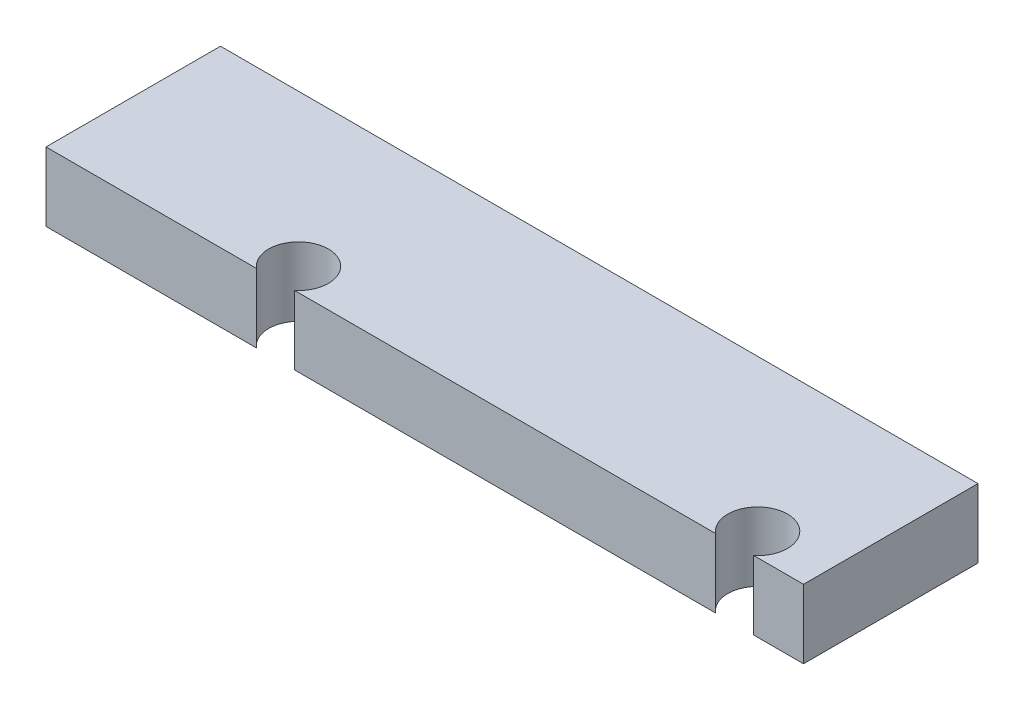
ISO-10303-21;
HEADER;
FILE_DESCRIPTION(('STEP AP214'),'2;1');
FILE_NAME('part.step','',(''),(''),'','','');
FILE_SCHEMA(('AUTOMOTIVE_DESIGN { 1 0 10303 214 1 1 1 1 }'));
ENDSEC;
DATA;
#1=APPLICATION_CONTEXT('core data for automotive mechanical design processes');
#2=APPLICATION_PROTOCOL_DEFINITION('international standard','automotive_design',2000,#1);
#3=PRODUCT_CONTEXT('',#1,'mechanical');
#4=PRODUCT('Part','Part','',(#3));
#5=PRODUCT_RELATED_PRODUCT_CATEGORY('part','',(#4));
#6=PRODUCT_DEFINITION_FORMATION('','',#4);
#7=PRODUCT_DEFINITION_CONTEXT('part definition',#1,'design');
#8=PRODUCT_DEFINITION('design','',#6,#7);
#9=PRODUCT_DEFINITION_SHAPE('','',#8);
#10=(LENGTH_UNIT() NAMED_UNIT(*) SI_UNIT(.MILLI.,.METRE.));
#11=(NAMED_UNIT(*) PLANE_ANGLE_UNIT() SI_UNIT($,.RADIAN.));
#12=(NAMED_UNIT(*) SI_UNIT($,.STERADIAN.) SOLID_ANGLE_UNIT());
#13=UNCERTAINTY_MEASURE_WITH_UNIT(LENGTH_MEASURE(1.E-05),#10,'distance_accuracy_value','');
#14=(GEOMETRIC_REPRESENTATION_CONTEXT(3) GLOBAL_UNCERTAINTY_ASSIGNED_CONTEXT((#13)) GLOBAL_UNIT_ASSIGNED_CONTEXT((#10,
#11,#12)) REPRESENTATION_CONTEXT('',''));
#15=CARTESIAN_POINT('',(0.,0.,0.));
#16=DIRECTION('',(0.,0.,1.));
#17=DIRECTION('',(1.,0.,0.));
#18=AXIS2_PLACEMENT_3D('',#15,#16,#17);
#19=CARTESIAN_POINT('',(-82.5,7.5,19.));
#20=DIRECTION('',(0.,0.,-1.));
#21=DIRECTION('',(-1.,0.,0.));
#22=AXIS2_PLACEMENT_3D('',#19,#20,#21);
#23=PLANE('',#22);
#24=DIRECTION('',(1.,0.,0.));
#25=VECTOR('',#24,1.);
#26=CARTESIAN_POINT('',(-82.5,-7.5,19.));
#27=LINE('',#26,#25);
#28=CARTESIAN_POINT('',(-28.3466880685408,-7.5,19.));
#29=VERTEX_POINT('',#28);
#30=CARTESIAN_POINT('',(63.346688068541,-7.5,19.));
#31=VERTEX_POINT('',#30);
#32=EDGE_CURVE('E110',#29,#31,#27,.T.);
#33=ORIENTED_EDGE('',*,*,#32,.T.);
#34=DIRECTION('',(0.,1.,0.));
#35=VECTOR('',#34,1.);
#36=CARTESIAN_POINT('',(63.346688068541,-7.5,19.));
#37=LINE('',#36,#35);
#38=CARTESIAN_POINT('',(63.346688068541,7.5,19.));
#39=VERTEX_POINT('',#38);
#40=EDGE_CURVE('E48',#31,#39,#37,.T.);
#41=ORIENTED_EDGE('',*,*,#40,.T.);
#42=DIRECTION('',(1.,0.,0.));
#43=VECTOR('',#42,1.);
#44=CARTESIAN_POINT('',(-82.5,7.5,19.));
#45=LINE('',#44,#43);
#46=CARTESIAN_POINT('',(-28.3466880685408,7.5,19.));
#47=VERTEX_POINT('',#46);
#48=EDGE_CURVE('E112',#47,#39,#45,.T.);
#49=ORIENTED_EDGE('',*,*,#48,.F.);
#50=DIRECTION('',(0.,1.,0.));
#51=VECTOR('',#50,1.);
#52=CARTESIAN_POINT('',(-28.3466880685408,-7.5,19.));
#53=LINE('',#52,#51);
#54=EDGE_CURVE('E98',#47,#29,#53,.F.);
#55=ORIENTED_EDGE('',*,*,#54,.T.);
#56=EDGE_LOOP('',(#33,#41,#49,#55));
#57=FACE_BOUND('',#56,.T.);
#58=ADVANCED_FACE('F33',(#57),#23,.F.);
#59=CARTESIAN_POINT('',(-82.5,-7.5,19.));
#60=VERTEX_POINT('',#59);
#61=CARTESIAN_POINT('',(-36.653311931459,-7.5,19.));
#62=VERTEX_POINT('',#61);
#63=EDGE_CURVE('E117',#60,#62,#27,.T.);
#64=ORIENTED_EDGE('',*,*,#63,.T.);
#65=DIRECTION('',(0.,1.,0.));
#66=VECTOR('',#65,1.);
#67=CARTESIAN_POINT('',(-36.653311931459,-7.5,19.));
#68=LINE('',#67,#66);
#69=CARTESIAN_POINT('',(-36.653311931459,7.5,19.));
#70=VERTEX_POINT('',#69);
#71=EDGE_CURVE('E56',#62,#70,#68,.T.);
#72=ORIENTED_EDGE('',*,*,#71,.T.);
#73=CARTESIAN_POINT('',(-82.5,7.5,19.));
#74=VERTEX_POINT('',#73);
#75=EDGE_CURVE('E129',#74,#70,#45,.T.);
#76=ORIENTED_EDGE('',*,*,#75,.F.);
#77=DIRECTION('',(0.,-1.,0.));
#78=VECTOR('',#77,1.);
#79=CARTESIAN_POINT('',(-82.5,7.5,19.));
#80=LINE('',#79,#78);
#81=EDGE_CURVE('E128',#74,#60,#80,.T.);
#82=ORIENTED_EDGE('',*,*,#81,.T.);
#83=EDGE_LOOP('',(#64,#72,#76,#82));
#84=FACE_BOUND('',#83,.T.);
#85=ADVANCED_FACE('F175',(#84),#23,.F.);
#86=CARTESIAN_POINT('',(82.5,7.5,19.));
#87=DIRECTION('',(-1.,0.,0.));
#88=DIRECTION('',(0.,0.,1.));
#89=AXIS2_PLACEMENT_3D('',#86,#87,#88);
#90=PLANE('',#89);
#91=DIRECTION('',(0.,0.,-1.));
#92=VECTOR('',#91,1.);
#93=CARTESIAN_POINT('',(82.5,-7.5,19.));
#94=LINE('',#93,#92);
#95=CARTESIAN_POINT('',(82.5,-7.5,19.));
#96=VERTEX_POINT('',#95);
#97=CARTESIAN_POINT('',(82.5,-7.5,-19.));
#98=VERTEX_POINT('',#97);
#99=EDGE_CURVE('E142',#96,#98,#94,.T.);
#100=ORIENTED_EDGE('',*,*,#99,.T.);
#101=DIRECTION('',(0.,-1.,0.));
#102=VECTOR('',#101,1.);
#103=CARTESIAN_POINT('',(82.5,7.5,-19.));
#104=LINE('',#103,#102);
#105=CARTESIAN_POINT('',(82.5,7.5,-19.));
#106=VERTEX_POINT('',#105);
#107=EDGE_CURVE('E11',#106,#98,#104,.T.);
#108=ORIENTED_EDGE('',*,*,#107,.F.);
#109=DIRECTION('',(0.,0.,-1.));
#110=VECTOR('',#109,1.);
#111=CARTESIAN_POINT('',(82.5,7.5,19.));
#112=LINE('',#111,#110);
#113=CARTESIAN_POINT('',(82.5,7.5,19.));
#114=VERTEX_POINT('',#113);
#115=EDGE_CURVE('E120',#114,#106,#112,.T.);
#116=ORIENTED_EDGE('',*,*,#115,.F.);
#117=DIRECTION('',(0.,-1.,0.));
#118=VECTOR('',#117,1.);
#119=CARTESIAN_POINT('',(82.5,7.5,19.));
#120=LINE('',#119,#118);
#121=EDGE_CURVE('E125',#114,#96,#120,.T.);
#122=ORIENTED_EDGE('',*,*,#121,.T.);
#123=EDGE_LOOP('',(#100,#108,#116,#122));
#124=FACE_BOUND('',#123,.T.);
#125=ADVANCED_FACE('F35',(#124),#90,.F.);
#126=CARTESIAN_POINT('',(-82.5,7.5,-19.));
#127=DIRECTION('',(0.,0.,1.));
#128=DIRECTION('',(1.,0.,0.));
#129=AXIS2_PLACEMENT_3D('',#126,#127,#128);
#130=PLANE('',#129);
#131=DIRECTION('',(-1.,0.,0.));
#132=VECTOR('',#131,1.);
#133=CARTESIAN_POINT('',(-82.5,-7.5,-19.));
#134=LINE('',#133,#132);
#135=CARTESIAN_POINT('',(-82.5,-7.5,-19.));
#136=VERTEX_POINT('',#135);
#137=EDGE_CURVE('E141',#98,#136,#134,.T.);
#138=ORIENTED_EDGE('',*,*,#137,.T.);
#139=DIRECTION('',(0.,-1.,0.));
#140=VECTOR('',#139,1.);
#141=CARTESIAN_POINT('',(-82.5,7.5,-19.));
#142=LINE('',#141,#140);
#143=CARTESIAN_POINT('',(-82.5,7.5,-19.));
#144=VERTEX_POINT('',#143);
#145=EDGE_CURVE('E41',#144,#136,#142,.T.);
#146=ORIENTED_EDGE('',*,*,#145,.F.);
#147=DIRECTION('',(-1.,0.,0.));
#148=VECTOR('',#147,1.);
#149=CARTESIAN_POINT('',(-82.5,7.5,-19.));
#150=LINE('',#149,#148);
#151=EDGE_CURVE('E150',#106,#144,#150,.T.);
#152=ORIENTED_EDGE('',*,*,#151,.F.);
#153=ORIENTED_EDGE('',*,*,#107,.T.);
#154=EDGE_LOOP('',(#138,#146,#152,#153));
#155=FACE_BOUND('',#154,.T.);
#156=ADVANCED_FACE('F172',(#155),#130,.F.);
#157=CARTESIAN_POINT('',(-82.5,7.5,19.));
#158=DIRECTION('',(1.,0.,0.));
#159=DIRECTION('',(0.,0.,-1.));
#160=AXIS2_PLACEMENT_3D('',#157,#158,#159);
#161=PLANE('',#160);
#162=DIRECTION('',(0.,0.,1.));
#163=VECTOR('',#162,1.);
#164=CARTESIAN_POINT('',(-82.5,-7.5,19.));
#165=LINE('',#164,#163);
#166=EDGE_CURVE('E121',#136,#60,#165,.T.);
#167=ORIENTED_EDGE('',*,*,#166,.T.);
#168=ORIENTED_EDGE('',*,*,#81,.F.);
#169=DIRECTION('',(0.,0.,1.));
#170=VECTOR('',#169,1.);
#171=CARTESIAN_POINT('',(-82.5,7.5,19.));
#172=LINE('',#171,#170);
#173=EDGE_CURVE('E138',#144,#74,#172,.T.);
#174=ORIENTED_EDGE('',*,*,#173,.F.);
#175=ORIENTED_EDGE('',*,*,#145,.T.);
#176=EDGE_LOOP('',(#167,#168,#174,#175));
#177=FACE_BOUND('',#176,.T.);
#178=ADVANCED_FACE('F136',(#177),#161,.F.);
#179=CARTESIAN_POINT('',(71.6533119314592,7.5,19.));
#180=VERTEX_POINT('',#179);
#181=EDGE_CURVE('E148',#180,#114,#45,.T.);
#182=ORIENTED_EDGE('',*,*,#181,.F.);
#183=DIRECTION('',(0.,1.,0.));
#184=VECTOR('',#183,1.);
#185=CARTESIAN_POINT('',(71.6533119314592,-7.5,19.));
#186=LINE('',#185,#184);
#187=CARTESIAN_POINT('',(71.6533119314592,-7.5,19.));
#188=VERTEX_POINT('',#187);
#189=EDGE_CURVE('E155',#180,#188,#186,.F.);
#190=ORIENTED_EDGE('',*,*,#189,.T.);
#191=EDGE_CURVE('E118',#188,#96,#27,.T.);
#192=ORIENTED_EDGE('',*,*,#191,.T.);
#193=ORIENTED_EDGE('',*,*,#121,.F.);
#194=EDGE_LOOP('',(#182,#190,#192,#193));
#195=FACE_BOUND('',#194,.T.);
#196=ADVANCED_FACE('F170',(#195),#23,.F.);
#197=CARTESIAN_POINT('',(0.,7.5,0.));
#198=DIRECTION('',(0.,-1.,0.));
#199=DIRECTION('',(0.,0.,-1.));
#200=AXIS2_PLACEMENT_3D('',#197,#198,#199);
#201=PLANE('',#200);
#202=ORIENTED_EDGE('',*,*,#48,.T.);
#203=CARTESIAN_POINT('',(67.5000000000001,7.5,14.));
#204=DIRECTION('',(0.,1.,0.));
#205=DIRECTION('',(0.,0.,1.));
#206=AXIS2_PLACEMENT_3D('',#203,#204,#205);
#207=CIRCLE('',#206,6.5);
#208=EDGE_CURVE('E104',#180,#39,#207,.T.);
#209=ORIENTED_EDGE('',*,*,#208,.F.);
#210=ORIENTED_EDGE('',*,*,#181,.T.);
#211=ORIENTED_EDGE('',*,*,#115,.T.);
#212=ORIENTED_EDGE('',*,*,#151,.T.);
#213=ORIENTED_EDGE('',*,*,#173,.T.);
#214=ORIENTED_EDGE('',*,*,#75,.T.);
#215=CARTESIAN_POINT('',(-32.4999999999999,7.5,14.));
#216=DIRECTION('',(0.,1.,0.));
#217=DIRECTION('',(0.,0.,1.));
#218=AXIS2_PLACEMENT_3D('',#215,#216,#217);
#219=CIRCLE('',#218,6.49999999999999);
#220=EDGE_CURVE('E105',#47,#70,#219,.T.);
#221=ORIENTED_EDGE('',*,*,#220,.F.);
#222=EDGE_LOOP('',(#202,#209,#210,#211,#212,#213,#214,#221));
#223=FACE_BOUND('',#222,.T.);
#224=ADVANCED_FACE('F165',(#223),#201,.F.);
#225=CARTESIAN_POINT('',(0.,-7.5,0.));
#226=DIRECTION('',(0.,-1.,0.));
#227=DIRECTION('',(0.,0.,-1.));
#228=AXIS2_PLACEMENT_3D('',#225,#226,#227);
#229=PLANE('',#228);
#230=CARTESIAN_POINT('',(67.5000000000001,-7.5,14.));
#231=DIRECTION('',(0.,1.,0.));
#232=DIRECTION('',(0.,0.,1.));
#233=AXIS2_PLACEMENT_3D('',#230,#231,#232);
#234=CIRCLE('',#233,6.5);
#235=EDGE_CURVE('E113',#188,#31,#234,.T.);
#236=ORIENTED_EDGE('',*,*,#235,.T.);
#237=ORIENTED_EDGE('',*,*,#32,.F.);
#238=CARTESIAN_POINT('',(-32.4999999999999,-7.5,14.));
#239=DIRECTION('',(0.,1.,0.));
#240=DIRECTION('',(0.,0.,1.));
#241=AXIS2_PLACEMENT_3D('',#238,#239,#240);
#242=CIRCLE('',#241,6.49999999999999);
#243=EDGE_CURVE('E95',#29,#62,#242,.T.);
#244=ORIENTED_EDGE('',*,*,#243,.T.);
#245=ORIENTED_EDGE('',*,*,#63,.F.);
#246=ORIENTED_EDGE('',*,*,#166,.F.);
#247=ORIENTED_EDGE('',*,*,#137,.F.);
#248=ORIENTED_EDGE('',*,*,#99,.F.);
#249=ORIENTED_EDGE('',*,*,#191,.F.);
#250=EDGE_LOOP('',(#236,#237,#244,#245,#246,#247,#248,#249));
#251=FACE_BOUND('',#250,.T.);
#252=ADVANCED_FACE('F115',(#251),#229,.T.);
#253=CARTESIAN_POINT('',(-32.4999999999999,-7.5,14.));
#254=DIRECTION('',(0.,1.,0.));
#255=DIRECTION('',(0.,0.,1.));
#256=AXIS2_PLACEMENT_3D('',#253,#254,#255);
#257=CYLINDRICAL_SURFACE('',#256,6.49999999999999);
#258=ORIENTED_EDGE('',*,*,#243,.F.);
#259=ORIENTED_EDGE('',*,*,#54,.F.);
#260=ORIENTED_EDGE('',*,*,#220,.T.);
#261=ORIENTED_EDGE('',*,*,#71,.F.);
#262=EDGE_LOOP('',(#258,#259,#260,#261));
#263=FACE_BOUND('',#262,.T.);
#264=ADVANCED_FACE('F97',(#263),#257,.F.);
#265=CARTESIAN_POINT('',(67.5000000000001,-7.5,14.));
#266=DIRECTION('',(0.,1.,0.));
#267=DIRECTION('',(0.,0.,1.));
#268=AXIS2_PLACEMENT_3D('',#265,#266,#267);
#269=CYLINDRICAL_SURFACE('',#268,6.5);
#270=ORIENTED_EDGE('',*,*,#235,.F.);
#271=ORIENTED_EDGE('',*,*,#189,.F.);
#272=ORIENTED_EDGE('',*,*,#208,.T.);
#273=ORIENTED_EDGE('',*,*,#40,.F.);
#274=EDGE_LOOP('',(#270,#271,#272,#273));
#275=FACE_BOUND('',#274,.T.);
#276=ADVANCED_FACE('F162',(#275),#269,.F.);
#277=CLOSED_SHELL('',(#58,#85,#125,#156,#178,#196,#224,#252,#264,#276));
#278=MANIFOLD_SOLID_BREP('B2',#277);
#279=ADVANCED_BREP_SHAPE_REPRESENTATION('',(#18,#278),#14);
#280=SHAPE_DEFINITION_REPRESENTATION(#9,#279);
ENDSEC;
END-ISO-10303-21;
